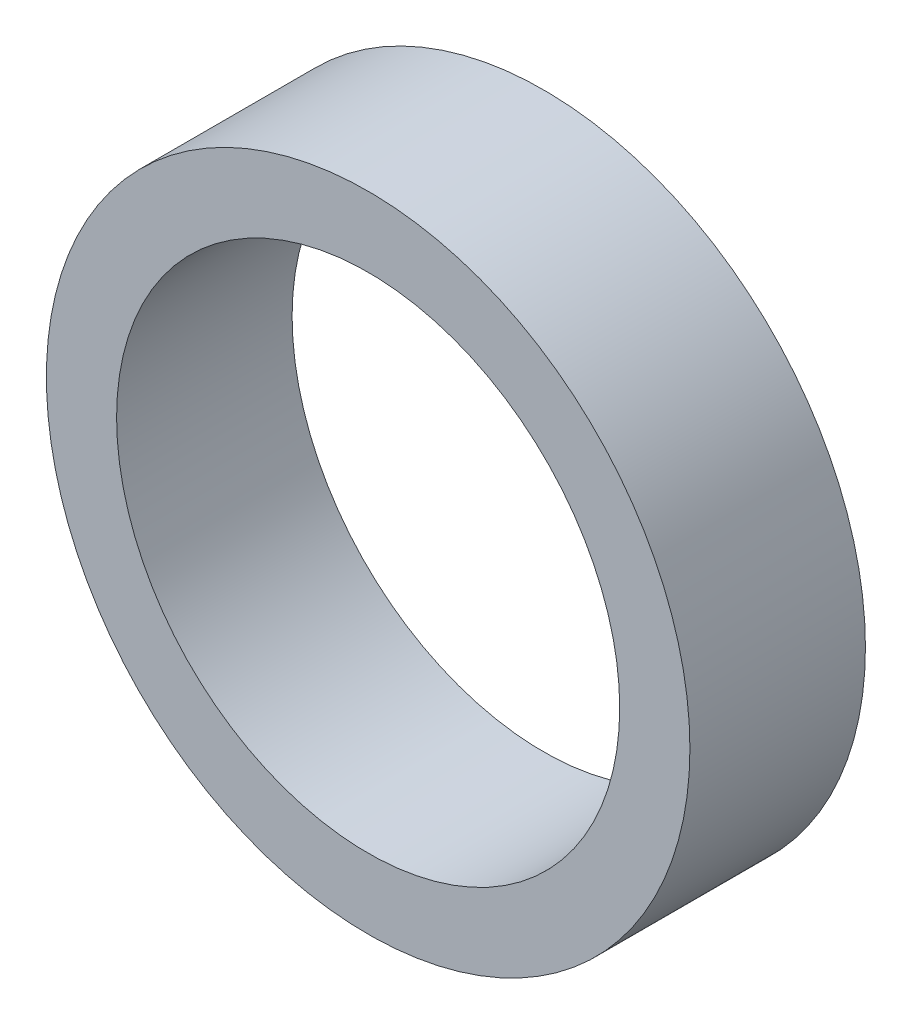
ISO-10303-21;
HEADER;
FILE_DESCRIPTION(('STEP AP214'),'2;1');
FILE_NAME('part.step','',(''),(''),'','','');
FILE_SCHEMA(('AUTOMOTIVE_DESIGN { 1 0 10303 214 1 1 1 1 }'));
ENDSEC;
DATA;
#1=APPLICATION_CONTEXT('core data for automotive mechanical design processes');
#2=APPLICATION_PROTOCOL_DEFINITION('international standard','automotive_design',2000,#1);
#3=PRODUCT_CONTEXT('',#1,'mechanical');
#4=PRODUCT('Part','Part','',(#3));
#5=PRODUCT_RELATED_PRODUCT_CATEGORY('part','',(#4));
#6=PRODUCT_DEFINITION_FORMATION('','',#4);
#7=PRODUCT_DEFINITION_CONTEXT('part definition',#1,'design');
#8=PRODUCT_DEFINITION('design','',#6,#7);
#9=PRODUCT_DEFINITION_SHAPE('','',#8);
#10=(LENGTH_UNIT() NAMED_UNIT(*) SI_UNIT(.MILLI.,.METRE.));
#11=(NAMED_UNIT(*) PLANE_ANGLE_UNIT() SI_UNIT($,.RADIAN.));
#12=(NAMED_UNIT(*) SI_UNIT($,.STERADIAN.) SOLID_ANGLE_UNIT());
#13=UNCERTAINTY_MEASURE_WITH_UNIT(LENGTH_MEASURE(1.E-05),#10,'distance_accuracy_value','');
#14=(GEOMETRIC_REPRESENTATION_CONTEXT(3) GLOBAL_UNCERTAINTY_ASSIGNED_CONTEXT((#13)) GLOBAL_UNIT_ASSIGNED_CONTEXT((#10,
#11,#12)) REPRESENTATION_CONTEXT('',''));
#15=CARTESIAN_POINT('',(0.,0.,0.));
#16=DIRECTION('',(0.,0.,1.));
#17=DIRECTION('',(1.,0.,0.));
#18=AXIS2_PLACEMENT_3D('',#15,#16,#17);
#19=CARTESIAN_POINT('',(0.,0.,30.));
#20=DIRECTION('',(0.,0.,1.));
#21=DIRECTION('',(1.,0.,0.));
#22=AXIS2_PLACEMENT_3D('',#19,#20,#21);
#23=PLANE('',#22);
#24=CARTESIAN_POINT('',(0.,0.,30.));
#25=DIRECTION('',(0.,0.,1.));
#26=DIRECTION('',(1.,0.,0.));
#27=AXIS2_PLACEMENT_3D('',#24,#25,#26);
#28=CIRCLE('',#27,55.);
#29=CARTESIAN_POINT('',(55.,0.,30.));
#30=VERTEX_POINT('',#29);
#31=EDGE_CURVE('E10',#30,#30,#28,.T.);
#32=ORIENTED_EDGE('',*,*,#31,.T.);
#33=EDGE_LOOP('',(#32));
#34=FACE_BOUND('',#33,.T.);
#35=CARTESIAN_POINT('',(0.,0.,30.));
#36=DIRECTION('',(0.,0.,1.));
#37=DIRECTION('',(1.,0.,0.));
#38=AXIS2_PLACEMENT_3D('',#35,#36,#37);
#39=CIRCLE('',#38,43.);
#40=CARTESIAN_POINT('',(43.,0.,30.));
#41=VERTEX_POINT('',#40);
#42=EDGE_CURVE('E25',#41,#41,#39,.T.);
#43=ORIENTED_EDGE('',*,*,#42,.F.);
#44=EDGE_LOOP('',(#43));
#45=FACE_BOUND('',#44,.T.);
#46=ADVANCED_FACE('F14',(#34,#45),#23,.T.);
#47=CARTESIAN_POINT('',(0.,0.,0.));
#48=DIRECTION('',(0.,0.,1.));
#49=DIRECTION('',(1.,0.,0.));
#50=AXIS2_PLACEMENT_3D('',#47,#48,#49);
#51=PLANE('',#50);
#52=CARTESIAN_POINT('',(0.,0.,0.));
#53=DIRECTION('',(0.,0.,1.));
#54=DIRECTION('',(1.,0.,0.));
#55=AXIS2_PLACEMENT_3D('',#52,#53,#54);
#56=CIRCLE('',#55,55.);
#57=CARTESIAN_POINT('',(55.,0.,0.));
#58=VERTEX_POINT('',#57);
#59=EDGE_CURVE('E18',#58,#58,#56,.T.);
#60=ORIENTED_EDGE('',*,*,#59,.F.);
#61=EDGE_LOOP('',(#60));
#62=FACE_BOUND('',#61,.T.);
#63=CARTESIAN_POINT('',(0.,0.,0.));
#64=DIRECTION('',(0.,0.,1.));
#65=DIRECTION('',(1.,0.,0.));
#66=AXIS2_PLACEMENT_3D('',#63,#64,#65);
#67=CIRCLE('',#66,43.);
#68=CARTESIAN_POINT('',(43.,0.,0.));
#69=VERTEX_POINT('',#68);
#70=EDGE_CURVE('E27',#69,#69,#67,.T.);
#71=ORIENTED_EDGE('',*,*,#70,.T.);
#72=EDGE_LOOP('',(#71));
#73=FACE_BOUND('',#72,.T.);
#74=ADVANCED_FACE('F37',(#62,#73),#51,.F.);
#75=CARTESIAN_POINT('',(0.,0.,30.));
#76=DIRECTION('',(0.,0.,-1.));
#77=DIRECTION('',(-1.,0.,0.));
#78=AXIS2_PLACEMENT_3D('',#75,#76,#77);
#79=CYLINDRICAL_SURFACE('',#78,55.);
#80=ORIENTED_EDGE('',*,*,#31,.F.);
#81=EDGE_LOOP('',(#80));
#82=FACE_BOUND('',#81,.T.);
#83=ORIENTED_EDGE('',*,*,#59,.T.);
#84=EDGE_LOOP('',(#83));
#85=FACE_BOUND('',#84,.T.);
#86=ADVANCED_FACE('F16',(#82,#85),#79,.T.);
#87=CARTESIAN_POINT('',(0.,0.,30.));
#88=DIRECTION('',(0.,0.,-1.));
#89=DIRECTION('',(-1.,0.,0.));
#90=AXIS2_PLACEMENT_3D('',#87,#88,#89);
#91=CYLINDRICAL_SURFACE('',#90,43.);
#92=ORIENTED_EDGE('',*,*,#42,.T.);
#93=EDGE_LOOP('',(#92));
#94=FACE_BOUND('',#93,.T.);
#95=ORIENTED_EDGE('',*,*,#70,.F.);
#96=EDGE_LOOP('',(#95));
#97=FACE_BOUND('',#96,.T.);
#98=ADVANCED_FACE('F33',(#94,#97),#91,.F.);
#99=CLOSED_SHELL('',(#46,#74,#86,#98));
#100=MANIFOLD_SOLID_BREP('B1',#99);
#101=ADVANCED_BREP_SHAPE_REPRESENTATION('',(#18,#100),#14);
#102=SHAPE_DEFINITION_REPRESENTATION(#9,#101);
ENDSEC;
END-ISO-10303-21;
